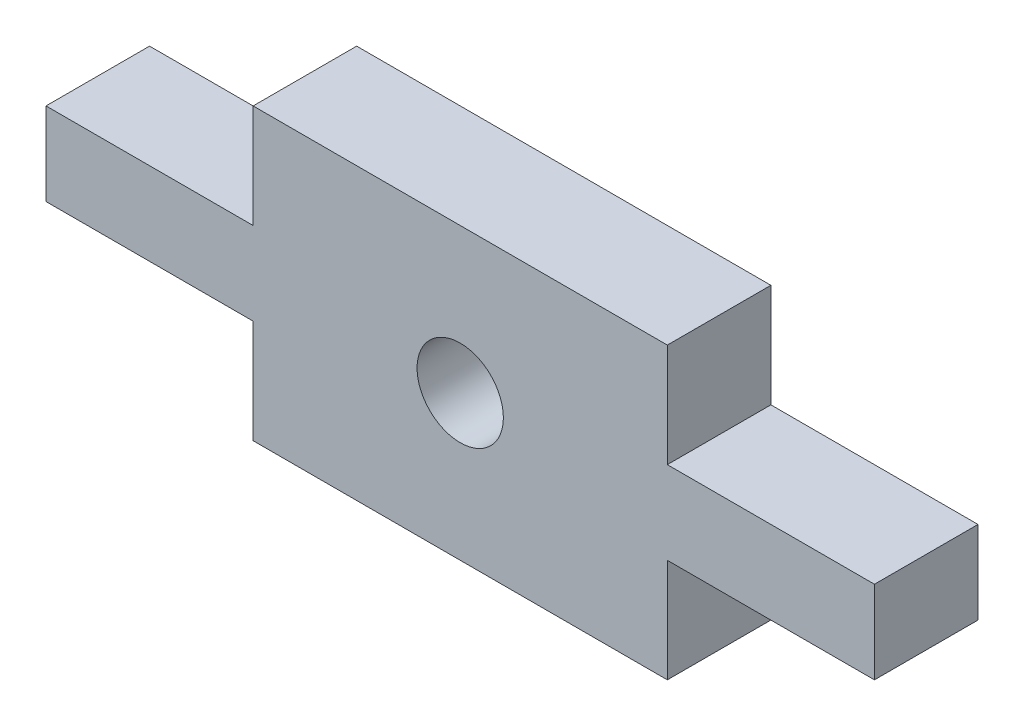
ISO-10303-21;
HEADER;
FILE_DESCRIPTION(('STEP AP214'),'2;1');
FILE_NAME('part.step','',(''),(''),'','','');
FILE_SCHEMA(('AUTOMOTIVE_DESIGN { 1 0 10303 214 1 1 1 1 }'));
ENDSEC;
DATA;
#1=APPLICATION_CONTEXT('core data for automotive mechanical design processes');
#2=APPLICATION_PROTOCOL_DEFINITION('international standard','automotive_design',2000,#1);
#3=PRODUCT_CONTEXT('',#1,'mechanical');
#4=PRODUCT('Part','Part','',(#3));
#5=PRODUCT_RELATED_PRODUCT_CATEGORY('part','',(#4));
#6=PRODUCT_DEFINITION_FORMATION('','',#4);
#7=PRODUCT_DEFINITION_CONTEXT('part definition',#1,'design');
#8=PRODUCT_DEFINITION('design','',#6,#7);
#9=PRODUCT_DEFINITION_SHAPE('','',#8);
#10=(LENGTH_UNIT() NAMED_UNIT(*) SI_UNIT(.MILLI.,.METRE.));
#11=(NAMED_UNIT(*) PLANE_ANGLE_UNIT() SI_UNIT($,.RADIAN.));
#12=(NAMED_UNIT(*) SI_UNIT($,.STERADIAN.) SOLID_ANGLE_UNIT());
#13=UNCERTAINTY_MEASURE_WITH_UNIT(LENGTH_MEASURE(1.E-05),#10,'distance_accuracy_value','');
#14=(GEOMETRIC_REPRESENTATION_CONTEXT(3) GLOBAL_UNCERTAINTY_ASSIGNED_CONTEXT((#13)) GLOBAL_UNIT_ASSIGNED_CONTEXT((#10,
#11,#12)) REPRESENTATION_CONTEXT('',''));
#15=CARTESIAN_POINT('',(0.,0.,0.));
#16=DIRECTION('',(0.,0.,1.));
#17=DIRECTION('',(1.,0.,0.));
#18=AXIS2_PLACEMENT_3D('',#15,#16,#17);
#19=CARTESIAN_POINT('',(0.,0.,3.));
#20=DIRECTION('',(0.,0.,1.));
#21=DIRECTION('',(1.,0.,0.));
#22=AXIS2_PLACEMENT_3D('',#19,#20,#21);
#23=PLANE('',#22);
#24=DIRECTION('',(0.999999999374987,-3.53557200880255E-05,0.));
#25=VECTOR('',#24,1.);
#26=CARTESIAN_POINT('',(224.799414289099,139.983869904515,3.));
#27=LINE('',#26,#25);
#28=CARTESIAN_POINT('',(218.799471831458,139.984082036801,3.));
#29=VERTEX_POINT('',#28);
#30=CARTESIAN_POINT('',(224.799414289099,139.983869904515,3.));
#31=VERTEX_POINT('',#30);
#32=EDGE_CURVE('E177',#29,#31,#27,.T.);
#33=ORIENTED_EDGE('',*,*,#32,.T.);
#34=DIRECTION('',(1.17851888581794E-05,0.999999999930555,0.));
#35=VECTOR('',#34,1.);
#36=CARTESIAN_POINT('',(224.799442574281,142.383931742159,3.));
#37=LINE('',#36,#35);
#38=CARTESIAN_POINT('',(224.799442574281,142.383931742159,3.));
#39=VERTEX_POINT('',#38);
#40=EDGE_CURVE('E105',#31,#39,#37,.T.);
#41=ORIENTED_EDGE('',*,*,#40,.T.);
#42=DIRECTION('',(-1.,0.,0.));
#43=VECTOR('',#42,1.);
#44=CARTESIAN_POINT('',(218.799429403462,142.383931742159,3.));
#45=LINE('',#44,#43);
#46=CARTESIAN_POINT('',(218.799429403462,142.383931742159,3.));
#47=VERTEX_POINT('',#46);
#48=EDGE_CURVE('E204',#39,#47,#45,.T.);
#49=ORIENTED_EDGE('',*,*,#48,.T.);
#50=DIRECTION('',(1.1785188959875E-05,0.999999999930555,0.));
#51=VECTOR('',#50,1.);
#52=CARTESIAN_POINT('',(218.799464760356,145.384044393169,3.));
#53=LINE('',#52,#51);
#54=CARTESIAN_POINT('',(218.799464760356,145.384044393169,3.));
#55=VERTEX_POINT('',#54);
#56=EDGE_CURVE('E223',#47,#55,#53,.T.);
#57=ORIENTED_EDGE('',*,*,#56,.T.);
#58=DIRECTION('',(-0.999999999930555,1.17851888732025E-05,0.));
#59=VECTOR('',#58,1.);
#60=CARTESIAN_POINT('',(206.799579841741,145.384185814079,3.));
#61=LINE('',#60,#59);
#62=CARTESIAN_POINT('',(206.799579841741,145.384185814079,3.));
#63=VERTEX_POINT('',#62);
#64=EDGE_CURVE('E220',#55,#63,#61,.T.);
#65=ORIENTED_EDGE('',*,*,#64,.T.);
#66=DIRECTION('',(-5.89238708226584E-05,-0.999999998263989,0.));
#67=VECTOR('',#66,1.);
#68=CARTESIAN_POINT('',(206.799403063491,142.384073164736,3.));
#69=LINE('',#68,#67);
#70=CARTESIAN_POINT('',(206.799403063491,142.384073164736,3.));
#71=VERTEX_POINT('',#70);
#72=EDGE_CURVE('E222',#63,#71,#69,.T.);
#73=ORIENTED_EDGE('',*,*,#72,.T.);
#74=DIRECTION('',(-0.999999999722221,2.35702759912856E-05,0.));
#75=VECTOR('',#74,1.);
#76=CARTESIAN_POINT('',(200.799389894339,142.384214586702,3.));
#77=LINE('',#76,#75);
#78=CARTESIAN_POINT('',(200.799389894339,142.384214586702,3.));
#79=VERTEX_POINT('',#78);
#80=EDGE_CURVE('E225',#71,#79,#77,.T.);
#81=ORIENTED_EDGE('',*,*,#80,.T.);
#82=DIRECTION('',(-1.17851888613967E-05,-0.999999999930555,0.));
#83=VECTOR('',#82,1.);
#84=CARTESIAN_POINT('',(200.799361609156,139.984152749714,3.));
#85=LINE('',#84,#83);
#86=CARTESIAN_POINT('',(200.799361609156,139.984152749714,3.));
#87=VERTEX_POINT('',#86);
#88=EDGE_CURVE('E231',#79,#87,#85,.T.);
#89=ORIENTED_EDGE('',*,*,#88,.T.);
#90=DIRECTION('',(1.,0.,0.));
#91=VECTOR('',#90,1.);
#92=CARTESIAN_POINT('',(206.799374779976,139.984152749714,3.));
#93=LINE('',#92,#91);
#94=CARTESIAN_POINT('',(206.799374779976,139.984152749714,3.));
#95=VERTEX_POINT('',#94);
#96=EDGE_CURVE('E136',#87,#95,#93,.T.);
#97=ORIENTED_EDGE('',*,*,#96,.T.);
#98=DIRECTION('',(1.17847077290529E-05,-0.99999999993056,0.));
#99=VECTOR('',#98,1.);
#100=CARTESIAN_POINT('',(206.799410134593,136.98411080839,3.));
#101=LINE('',#100,#99);
#102=CARTESIAN_POINT('',(206.799410134593,136.98411080839,3.));
#103=VERTEX_POINT('',#102);
#104=EDGE_CURVE('E130',#95,#103,#101,.T.);
#105=ORIENTED_EDGE('',*,*,#104,.T.);
#106=DIRECTION('',(0.999999999982639,-5.89257828825621E-06,0.));
#107=VECTOR('',#106,1.);
#108=CARTESIAN_POINT('',(206.799410134593,136.98411080839,3.));
#109=LINE('',#108,#107);
#110=CARTESIAN_POINT('',(218.799365764719,136.984040097712,3.));
#111=VERTEX_POINT('',#110);
#112=EDGE_CURVE('E134',#103,#111,#109,.T.);
#113=ORIENTED_EDGE('',*,*,#112,.T.);
#114=DIRECTION('',(3.53550853736853E-05,0.999999999375009,0.));
#115=VECTOR('',#114,1.);
#116=CARTESIAN_POINT('',(218.799471831458,139.984082036801,3.));
#117=LINE('',#116,#115);
#118=EDGE_CURVE('E50',#111,#29,#117,.T.);
#119=ORIENTED_EDGE('',*,*,#118,.T.);
#120=EDGE_LOOP('',(#33,#41,#49,#57,#65,#73,#81,#89,#97,#105,#113,#119));
#121=FACE_BOUND('',#120,.T.);
#122=CARTESIAN_POINT('',(212.79947280323,141.184112955702,3.));
#123=DIRECTION('',(0.,0.,1.));
#124=DIRECTION('',(1.,0.,0.));
#125=AXIS2_PLACEMENT_3D('',#122,#123,#124);
#126=CIRCLE('',#125,1.24999999999998);
#127=CARTESIAN_POINT('',(214.04947280323,141.184112955702,3.));
#128=VERTEX_POINT('',#127);
#129=EDGE_CURVE('E158',#128,#128,#126,.T.);
#130=ORIENTED_EDGE('',*,*,#129,.F.);
#131=EDGE_LOOP('',(#130));
#132=FACE_BOUND('',#131,.T.);
#133=ADVANCED_FACE('F33',(#121,#132),#23,.T.);
#134=CARTESIAN_POINT('',(0.,0.,0.));
#135=DIRECTION('',(0.,0.,1.));
#136=DIRECTION('',(1.,0.,0.));
#137=AXIS2_PLACEMENT_3D('',#134,#135,#136);
#138=PLANE('',#137);
#139=DIRECTION('',(0.999999999374987,-3.53557200880255E-05,0.));
#140=VECTOR('',#139,1.);
#141=CARTESIAN_POINT('',(224.799414289099,139.983869904515,0.));
#142=LINE('',#141,#140);
#143=CARTESIAN_POINT('',(218.799471831458,139.984082036801,0.));
#144=VERTEX_POINT('',#143);
#145=CARTESIAN_POINT('',(224.799414289099,139.983869904515,0.));
#146=VERTEX_POINT('',#145);
#147=EDGE_CURVE('E154',#144,#146,#142,.T.);
#148=ORIENTED_EDGE('',*,*,#147,.F.);
#149=DIRECTION('',(3.53550853736853E-05,0.999999999375009,0.));
#150=VECTOR('',#149,1.);
#151=CARTESIAN_POINT('',(218.799471831458,139.984082036801,0.));
#152=LINE('',#151,#150);
#153=CARTESIAN_POINT('',(218.799365764719,136.984040097712,0.));
#154=VERTEX_POINT('',#153);
#155=EDGE_CURVE('E97',#154,#144,#152,.T.);
#156=ORIENTED_EDGE('',*,*,#155,.F.);
#157=DIRECTION('',(0.999999999982639,-5.89257828825621E-06,0.));
#158=VECTOR('',#157,1.);
#159=CARTESIAN_POINT('',(206.799410134593,136.98411080839,0.));
#160=LINE('',#159,#158);
#161=CARTESIAN_POINT('',(206.799410134593,136.98411080839,0.));
#162=VERTEX_POINT('',#161);
#163=EDGE_CURVE('E91',#162,#154,#160,.T.);
#164=ORIENTED_EDGE('',*,*,#163,.F.);
#165=DIRECTION('',(1.17847077290529E-05,-0.99999999993056,0.));
#166=VECTOR('',#165,1.);
#167=CARTESIAN_POINT('',(206.799410134593,136.98411080839,0.));
#168=LINE('',#167,#166);
#169=CARTESIAN_POINT('',(206.799374779976,139.984152749714,0.));
#170=VERTEX_POINT('',#169);
#171=EDGE_CURVE('E144',#170,#162,#168,.T.);
#172=ORIENTED_EDGE('',*,*,#171,.F.);
#173=DIRECTION('',(1.,0.,0.));
#174=VECTOR('',#173,1.);
#175=CARTESIAN_POINT('',(206.799374779976,139.984152749714,0.));
#176=LINE('',#175,#174);
#177=CARTESIAN_POINT('',(200.799361609156,139.984152749714,0.));
#178=VERTEX_POINT('',#177);
#179=EDGE_CURVE('E172',#178,#170,#176,.T.);
#180=ORIENTED_EDGE('',*,*,#179,.F.);
#181=DIRECTION('',(-1.17851888613967E-05,-0.999999999930555,0.));
#182=VECTOR('',#181,1.);
#183=CARTESIAN_POINT('',(200.799361609156,139.984152749714,0.));
#184=LINE('',#183,#182);
#185=CARTESIAN_POINT('',(200.799389894339,142.384214586702,0.));
#186=VERTEX_POINT('',#185);
#187=EDGE_CURVE('E170',#186,#178,#184,.T.);
#188=ORIENTED_EDGE('',*,*,#187,.F.);
#189=DIRECTION('',(-0.999999999722221,2.35702759912856E-05,0.));
#190=VECTOR('',#189,1.);
#191=CARTESIAN_POINT('',(200.799389894339,142.384214586702,0.));
#192=LINE('',#191,#190);
#193=CARTESIAN_POINT('',(206.799403063491,142.384073164736,0.));
#194=VERTEX_POINT('',#193);
#195=EDGE_CURVE('E168',#194,#186,#192,.T.);
#196=ORIENTED_EDGE('',*,*,#195,.F.);
#197=DIRECTION('',(-5.89238708226584E-05,-0.999999998263989,0.));
#198=VECTOR('',#197,1.);
#199=CARTESIAN_POINT('',(206.799403063491,142.384073164736,0.));
#200=LINE('',#199,#198);
#201=CARTESIAN_POINT('',(206.799579841741,145.384185814079,0.));
#202=VERTEX_POINT('',#201);
#203=EDGE_CURVE('E166',#202,#194,#200,.T.);
#204=ORIENTED_EDGE('',*,*,#203,.F.);
#205=DIRECTION('',(-0.999999999930555,1.17851888732025E-05,0.));
#206=VECTOR('',#205,1.);
#207=CARTESIAN_POINT('',(206.799579841741,145.384185814079,0.));
#208=LINE('',#207,#206);
#209=CARTESIAN_POINT('',(218.799464760356,145.384044393169,0.));
#210=VERTEX_POINT('',#209);
#211=EDGE_CURVE('E164',#210,#202,#208,.T.);
#212=ORIENTED_EDGE('',*,*,#211,.F.);
#213=DIRECTION('',(1.1785188959875E-05,0.999999999930555,0.));
#214=VECTOR('',#213,1.);
#215=CARTESIAN_POINT('',(218.799464760356,145.384044393169,0.));
#216=LINE('',#215,#214);
#217=CARTESIAN_POINT('',(218.799429403462,142.383931742159,0.));
#218=VERTEX_POINT('',#217);
#219=EDGE_CURVE('E162',#218,#210,#216,.T.);
#220=ORIENTED_EDGE('',*,*,#219,.F.);
#221=DIRECTION('',(-1.,0.,0.));
#222=VECTOR('',#221,1.);
#223=CARTESIAN_POINT('',(218.799429403462,142.383931742159,0.));
#224=LINE('',#223,#222);
#225=CARTESIAN_POINT('',(224.799442574281,142.383931742159,0.));
#226=VERTEX_POINT('',#225);
#227=EDGE_CURVE('E160',#226,#218,#224,.T.);
#228=ORIENTED_EDGE('',*,*,#227,.F.);
#229=DIRECTION('',(1.17851888581794E-05,0.999999999930555,0.));
#230=VECTOR('',#229,1.);
#231=CARTESIAN_POINT('',(224.799442574281,142.383931742159,0.));
#232=LINE('',#231,#230);
#233=EDGE_CURVE('E157',#146,#226,#232,.T.);
#234=ORIENTED_EDGE('',*,*,#233,.F.);
#235=EDGE_LOOP('',(#148,#156,#164,#172,#180,#188,#196,#204,#212,#220,#228,#234));
#236=FACE_BOUND('',#235,.T.);
#237=CARTESIAN_POINT('',(212.79947280323,141.184112955702,0.));
#238=DIRECTION('',(0.,0.,1.));
#239=DIRECTION('',(1.,0.,0.));
#240=AXIS2_PLACEMENT_3D('',#237,#238,#239);
#241=CIRCLE('',#240,1.24999999999998);
#242=CARTESIAN_POINT('',(214.04947280323,141.184112955702,0.));
#243=VERTEX_POINT('',#242);
#244=EDGE_CURVE('E378',#243,#243,#241,.T.);
#245=ORIENTED_EDGE('',*,*,#244,.T.);
#246=EDGE_LOOP('',(#245));
#247=FACE_BOUND('',#246,.T.);
#248=ADVANCED_FACE('F208',(#236,#247),#138,.F.);
#249=CARTESIAN_POINT('',(224.799414289099,139.983869904515,3.));
#250=DIRECTION('',(3.53557200880255E-05,0.999999999374987,0.));
#251=DIRECTION('',(-0.999999999374987,3.53557200880255E-05,0.));
#252=AXIS2_PLACEMENT_3D('',#249,#250,#251);
#253=PLANE('',#252);
#254=ORIENTED_EDGE('',*,*,#147,.T.);
#255=DIRECTION('',(0.,0.,-1.));
#256=VECTOR('',#255,1.);
#257=CARTESIAN_POINT('',(224.799414289099,139.983869904515,3.));
#258=LINE('',#257,#256);
#259=EDGE_CURVE('E11',#31,#146,#258,.T.);
#260=ORIENTED_EDGE('',*,*,#259,.F.);
#261=ORIENTED_EDGE('',*,*,#32,.F.);
#262=DIRECTION('',(0.,0.,-1.));
#263=VECTOR('',#262,1.);
#264=CARTESIAN_POINT('',(218.799471831458,139.984082036801,3.));
#265=LINE('',#264,#263);
#266=EDGE_CURVE('E150',#29,#144,#265,.T.);
#267=ORIENTED_EDGE('',*,*,#266,.T.);
#268=EDGE_LOOP('',(#254,#260,#261,#267));
#269=FACE_BOUND('',#268,.T.);
#270=ADVANCED_FACE('F35',(#269),#253,.F.);
#271=CARTESIAN_POINT('',(224.799442574281,142.383931742159,3.));
#272=DIRECTION('',(-0.999999999930555,1.17851888581794E-05,0.));
#273=DIRECTION('',(-1.17851888581794E-05,-0.999999999930555,0.));
#274=AXIS2_PLACEMENT_3D('',#271,#272,#273);
#275=PLANE('',#274);
#276=ORIENTED_EDGE('',*,*,#233,.T.);
#277=DIRECTION('',(0.,0.,-1.));
#278=VECTOR('',#277,1.);
#279=CARTESIAN_POINT('',(224.799442574281,142.383931742159,3.));
#280=LINE('',#279,#278);
#281=EDGE_CURVE('E42',#39,#226,#280,.T.);
#282=ORIENTED_EDGE('',*,*,#281,.F.);
#283=ORIENTED_EDGE('',*,*,#40,.F.);
#284=ORIENTED_EDGE('',*,*,#259,.T.);
#285=EDGE_LOOP('',(#276,#282,#283,#284));
#286=FACE_BOUND('',#285,.T.);
#287=ADVANCED_FACE('F265',(#286),#275,.F.);
#288=CARTESIAN_POINT('',(218.799429403462,142.383931742159,3.));
#289=DIRECTION('',(0.,-1.,0.));
#290=DIRECTION('',(0.,0.,-1.));
#291=AXIS2_PLACEMENT_3D('',#288,#289,#290);
#292=PLANE('',#291);
#293=ORIENTED_EDGE('',*,*,#227,.T.);
#294=DIRECTION('',(0.,0.,-1.));
#295=VECTOR('',#294,1.);
#296=CARTESIAN_POINT('',(218.799429403462,142.383931742159,3.));
#297=LINE('',#296,#295);
#298=EDGE_CURVE('E196',#47,#218,#297,.T.);
#299=ORIENTED_EDGE('',*,*,#298,.F.);
#300=ORIENTED_EDGE('',*,*,#48,.F.);
#301=ORIENTED_EDGE('',*,*,#281,.T.);
#302=EDGE_LOOP('',(#293,#299,#300,#301));
#303=FACE_BOUND('',#302,.T.);
#304=ADVANCED_FACE('F202',(#303),#292,.F.);
#305=CARTESIAN_POINT('',(218.799464760356,145.384044393169,3.));
#306=DIRECTION('',(-0.999999999930555,1.1785188959875E-05,0.));
#307=DIRECTION('',(-1.1785188959875E-05,-0.999999999930555,0.));
#308=AXIS2_PLACEMENT_3D('',#305,#306,#307);
#309=PLANE('',#308);
#310=ORIENTED_EDGE('',*,*,#219,.T.);
#311=DIRECTION('',(0.,0.,-1.));
#312=VECTOR('',#311,1.);
#313=CARTESIAN_POINT('',(218.799464760356,145.384044393169,3.));
#314=LINE('',#313,#312);
#315=EDGE_CURVE('E193',#55,#210,#314,.T.);
#316=ORIENTED_EDGE('',*,*,#315,.F.);
#317=ORIENTED_EDGE('',*,*,#56,.F.);
#318=ORIENTED_EDGE('',*,*,#298,.T.);
#319=EDGE_LOOP('',(#310,#316,#317,#318));
#320=FACE_BOUND('',#319,.T.);
#321=ADVANCED_FACE('F214',(#320),#309,.F.);
#322=CARTESIAN_POINT('',(206.799579841741,145.384185814079,3.));
#323=DIRECTION('',(-1.17851888732025E-05,-0.999999999930555,0.));
#324=DIRECTION('',(0.999999999930555,-1.17851888732025E-05,0.));
#325=AXIS2_PLACEMENT_3D('',#322,#323,#324);
#326=PLANE('',#325);
#327=ORIENTED_EDGE('',*,*,#211,.T.);
#328=DIRECTION('',(0.,0.,-1.));
#329=VECTOR('',#328,1.);
#330=CARTESIAN_POINT('',(206.799579841741,145.384185814079,3.));
#331=LINE('',#330,#329);
#332=EDGE_CURVE('E190',#63,#202,#331,.T.);
#333=ORIENTED_EDGE('',*,*,#332,.F.);
#334=ORIENTED_EDGE('',*,*,#64,.F.);
#335=ORIENTED_EDGE('',*,*,#315,.T.);
#336=EDGE_LOOP('',(#327,#333,#334,#335));
#337=FACE_BOUND('',#336,.T.);
#338=ADVANCED_FACE('F218',(#337),#326,.F.);
#339=CARTESIAN_POINT('',(206.799403063491,142.384073164736,3.));
#340=DIRECTION('',(0.999999998263989,-5.89238708226584E-05,0.));
#341=DIRECTION('',(5.89238708226584E-05,0.999999998263989,0.));
#342=AXIS2_PLACEMENT_3D('',#339,#340,#341);
#343=PLANE('',#342);
#344=ORIENTED_EDGE('',*,*,#203,.T.);
#345=DIRECTION('',(0.,0.,-1.));
#346=VECTOR('',#345,1.);
#347=CARTESIAN_POINT('',(206.799403063491,142.384073164736,3.));
#348=LINE('',#347,#346);
#349=EDGE_CURVE('E187',#71,#194,#348,.T.);
#350=ORIENTED_EDGE('',*,*,#349,.F.);
#351=ORIENTED_EDGE('',*,*,#72,.F.);
#352=ORIENTED_EDGE('',*,*,#332,.T.);
#353=EDGE_LOOP('',(#344,#350,#351,#352));
#354=FACE_BOUND('',#353,.T.);
#355=ADVANCED_FACE('F278',(#354),#343,.F.);
#356=CARTESIAN_POINT('',(200.799389894339,142.384214586702,3.));
#357=DIRECTION('',(-2.35702759912856E-05,-0.999999999722221,0.));
#358=DIRECTION('',(0.999999999722221,-2.35702759912856E-05,0.));
#359=AXIS2_PLACEMENT_3D('',#356,#357,#358);
#360=PLANE('',#359);
#361=ORIENTED_EDGE('',*,*,#195,.T.);
#362=DIRECTION('',(0.,0.,-1.));
#363=VECTOR('',#362,1.);
#364=CARTESIAN_POINT('',(200.799389894339,142.384214586702,3.));
#365=LINE('',#364,#363);
#366=EDGE_CURVE('E184',#79,#186,#365,.T.);
#367=ORIENTED_EDGE('',*,*,#366,.F.);
#368=ORIENTED_EDGE('',*,*,#80,.F.);
#369=ORIENTED_EDGE('',*,*,#349,.T.);
#370=EDGE_LOOP('',(#361,#367,#368,#369));
#371=FACE_BOUND('',#370,.T.);
#372=ADVANCED_FACE('F281',(#371),#360,.F.);
#373=CARTESIAN_POINT('',(200.799361609156,139.984152749714,3.));
#374=DIRECTION('',(0.999999999930555,-1.17851888613967E-05,0.));
#375=DIRECTION('',(1.17851888613967E-05,0.999999999930555,0.));
#376=AXIS2_PLACEMENT_3D('',#373,#374,#375);
#377=PLANE('',#376);
#378=ORIENTED_EDGE('',*,*,#187,.T.);
#379=DIRECTION('',(0.,0.,-1.));
#380=VECTOR('',#379,1.);
#381=CARTESIAN_POINT('',(200.799361609156,139.984152749714,3.));
#382=LINE('',#381,#380);
#383=EDGE_CURVE('E181',#87,#178,#382,.T.);
#384=ORIENTED_EDGE('',*,*,#383,.F.);
#385=ORIENTED_EDGE('',*,*,#88,.F.);
#386=ORIENTED_EDGE('',*,*,#366,.T.);
#387=EDGE_LOOP('',(#378,#384,#385,#386));
#388=FACE_BOUND('',#387,.T.);
#389=ADVANCED_FACE('F237',(#388),#377,.F.);
#390=CARTESIAN_POINT('',(206.799374779976,139.984152749714,3.));
#391=DIRECTION('',(0.,1.,0.));
#392=DIRECTION('',(0.,0.,1.));
#393=AXIS2_PLACEMENT_3D('',#390,#391,#392);
#394=PLANE('',#393);
#395=ORIENTED_EDGE('',*,*,#179,.T.);
#396=DIRECTION('',(0.,0.,-1.));
#397=VECTOR('',#396,1.);
#398=CARTESIAN_POINT('',(206.799374779976,139.984152749714,3.));
#399=LINE('',#398,#397);
#400=EDGE_CURVE('E145',#95,#170,#399,.T.);
#401=ORIENTED_EDGE('',*,*,#400,.F.);
#402=ORIENTED_EDGE('',*,*,#96,.F.);
#403=ORIENTED_EDGE('',*,*,#383,.T.);
#404=EDGE_LOOP('',(#395,#401,#402,#403));
#405=FACE_BOUND('',#404,.T.);
#406=ADVANCED_FACE('F241',(#405),#394,.F.);
#407=CARTESIAN_POINT('',(206.799410134593,136.98411080839,3.));
#408=DIRECTION('',(0.99999999993056,1.17847077290529E-05,0.));
#409=DIRECTION('',(-1.17847077290529E-05,0.99999999993056,0.));
#410=AXIS2_PLACEMENT_3D('',#407,#408,#409);
#411=PLANE('',#410);
#412=ORIENTED_EDGE('',*,*,#171,.T.);
#413=DIRECTION('',(0.,0.,-1.));
#414=VECTOR('',#413,1.);
#415=CARTESIAN_POINT('',(206.799410134593,136.98411080839,3.));
#416=LINE('',#415,#414);
#417=EDGE_CURVE('E141',#103,#162,#416,.T.);
#418=ORIENTED_EDGE('',*,*,#417,.F.);
#419=ORIENTED_EDGE('',*,*,#104,.F.);
#420=ORIENTED_EDGE('',*,*,#400,.T.);
#421=EDGE_LOOP('',(#412,#418,#419,#420));
#422=FACE_BOUND('',#421,.T.);
#423=ADVANCED_FACE('F142',(#422),#411,.F.);
#424=CARTESIAN_POINT('',(206.799410134593,136.98411080839,3.));
#425=DIRECTION('',(5.8925782882562E-06,0.999999999982639,0.));
#426=DIRECTION('',(-0.999999999982639,5.89257828825621E-06,0.));
#427=AXIS2_PLACEMENT_3D('',#424,#425,#426);
#428=PLANE('',#427);
#429=ORIENTED_EDGE('',*,*,#163,.T.);
#430=DIRECTION('',(0.,0.,-1.));
#431=VECTOR('',#430,1.);
#432=CARTESIAN_POINT('',(218.799365764719,136.984040097712,3.));
#433=LINE('',#432,#431);
#434=EDGE_CURVE('E146',#111,#154,#433,.T.);
#435=ORIENTED_EDGE('',*,*,#434,.F.);
#436=ORIENTED_EDGE('',*,*,#112,.F.);
#437=ORIENTED_EDGE('',*,*,#417,.T.);
#438=EDGE_LOOP('',(#429,#435,#436,#437));
#439=FACE_BOUND('',#438,.T.);
#440=ADVANCED_FACE('F148',(#439),#428,.F.);
#441=CARTESIAN_POINT('',(218.799471831458,139.984082036801,3.));
#442=DIRECTION('',(-0.999999999375009,3.53550853736853E-05,0.));
#443=DIRECTION('',(-3.53550853736853E-05,-0.999999999375009,0.));
#444=AXIS2_PLACEMENT_3D('',#441,#442,#443);
#445=PLANE('',#444);
#446=ORIENTED_EDGE('',*,*,#155,.T.);
#447=ORIENTED_EDGE('',*,*,#266,.F.);
#448=ORIENTED_EDGE('',*,*,#118,.F.);
#449=ORIENTED_EDGE('',*,*,#434,.T.);
#450=EDGE_LOOP('',(#446,#447,#448,#449));
#451=FACE_BOUND('',#450,.T.);
#452=ADVANCED_FACE('F245',(#451),#445,.F.);
#453=CARTESIAN_POINT('',(212.79947280323,141.184112955702,3.));
#454=DIRECTION('',(0.,0.,-1.));
#455=DIRECTION('',(-1.,0.,0.));
#456=AXIS2_PLACEMENT_3D('',#453,#454,#455);
#457=CYLINDRICAL_SURFACE('',#456,1.24999999999998);
#458=ORIENTED_EDGE('',*,*,#129,.T.);
#459=EDGE_LOOP('',(#458));
#460=FACE_BOUND('',#459,.T.);
#461=ORIENTED_EDGE('',*,*,#244,.F.);
#462=EDGE_LOOP('',(#461));
#463=FACE_BOUND('',#462,.T.);
#464=ADVANCED_FACE('F247',(#460,#463),#457,.F.);
#465=CLOSED_SHELL('',(#133,#248,#270,#287,#304,#321,#338,#355,#372,#389,#406,#423,#440,#452,#464));
#466=MANIFOLD_SOLID_BREP('B2',#465);
#467=ADVANCED_BREP_SHAPE_REPRESENTATION('',(#18,#466),#14);
#468=SHAPE_DEFINITION_REPRESENTATION(#9,#467);
ENDSEC;
END-ISO-10303-21;
